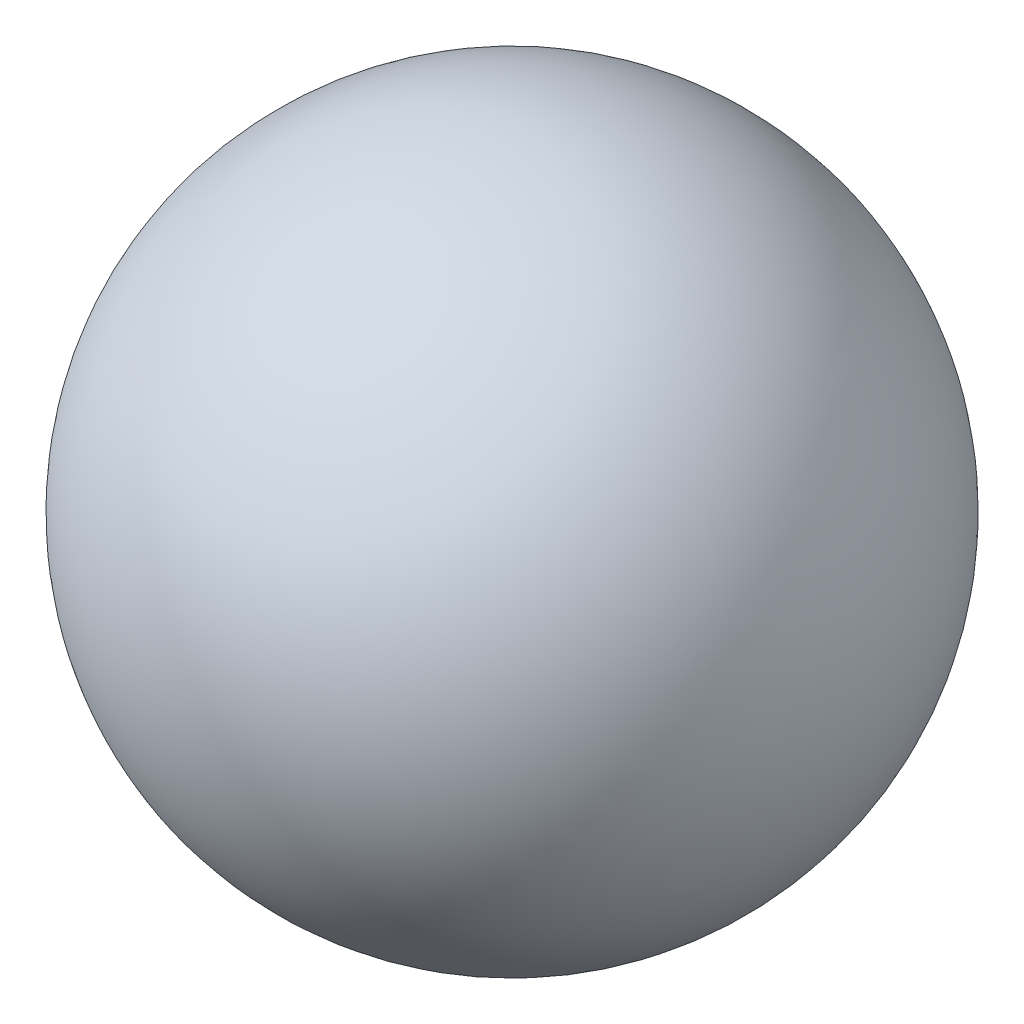
ISO-10303-21;
HEADER;
FILE_DESCRIPTION(('STEP AP214'),'2;1');
FILE_NAME('part.step','',(''),(''),'','','');
FILE_SCHEMA(('AUTOMOTIVE_DESIGN { 1 0 10303 214 1 1 1 1 }'));
ENDSEC;
DATA;
#1=APPLICATION_CONTEXT('core data for automotive mechanical design processes');
#2=APPLICATION_PROTOCOL_DEFINITION('international standard','automotive_design',2000,#1);
#3=PRODUCT_CONTEXT('',#1,'mechanical');
#4=PRODUCT('Part','Part','',(#3));
#5=PRODUCT_RELATED_PRODUCT_CATEGORY('part','',(#4));
#6=PRODUCT_DEFINITION_FORMATION('','',#4);
#7=PRODUCT_DEFINITION_CONTEXT('part definition',#1,'design');
#8=PRODUCT_DEFINITION('design','',#6,#7);
#9=PRODUCT_DEFINITION_SHAPE('','',#8);
#10=(LENGTH_UNIT() NAMED_UNIT(*) SI_UNIT(.MILLI.,.METRE.));
#11=(NAMED_UNIT(*) PLANE_ANGLE_UNIT() SI_UNIT($,.RADIAN.));
#12=(NAMED_UNIT(*) SI_UNIT($,.STERADIAN.) SOLID_ANGLE_UNIT());
#13=UNCERTAINTY_MEASURE_WITH_UNIT(LENGTH_MEASURE(1.E-05),#10,'distance_accuracy_value','');
#14=(GEOMETRIC_REPRESENTATION_CONTEXT(3) GLOBAL_UNCERTAINTY_ASSIGNED_CONTEXT((#13)) GLOBAL_UNIT_ASSIGNED_CONTEXT((#10,
#11,#12)) REPRESENTATION_CONTEXT('',''));
#15=CARTESIAN_POINT('',(0.,0.,0.));
#16=DIRECTION('',(0.,0.,1.));
#17=DIRECTION('',(1.,0.,0.));
#18=AXIS2_PLACEMENT_3D('',#15,#16,#17);
#19=CARTESIAN_POINT('',(0.,0.,0.));
#20=DIRECTION('',(0.,0.,1.));
#21=DIRECTION('',(-1.,0.,0.));
#22=AXIS2_PLACEMENT_3D('',#19,#20,#21);
#23=SPHERICAL_SURFACE('',#22,28.575);
#24=CARTESIAN_POINT('',(0.,0.,28.575));
#25=VERTEX_POINT('',#24);
#26=VERTEX_LOOP('',#25);
#27=FACE_BOUND('',#26,.T.);
#28=ADVANCED_FACE('F30',(#27),#23,.T.);
#29=CLOSED_SHELL('',(#28));
#30=MANIFOLD_SOLID_BREP('B2',#29);
#31=ADVANCED_BREP_SHAPE_REPRESENTATION('',(#18,#30),#14);
#32=SHAPE_DEFINITION_REPRESENTATION(#9,#31);
ENDSEC;
END-ISO-10303-21;
